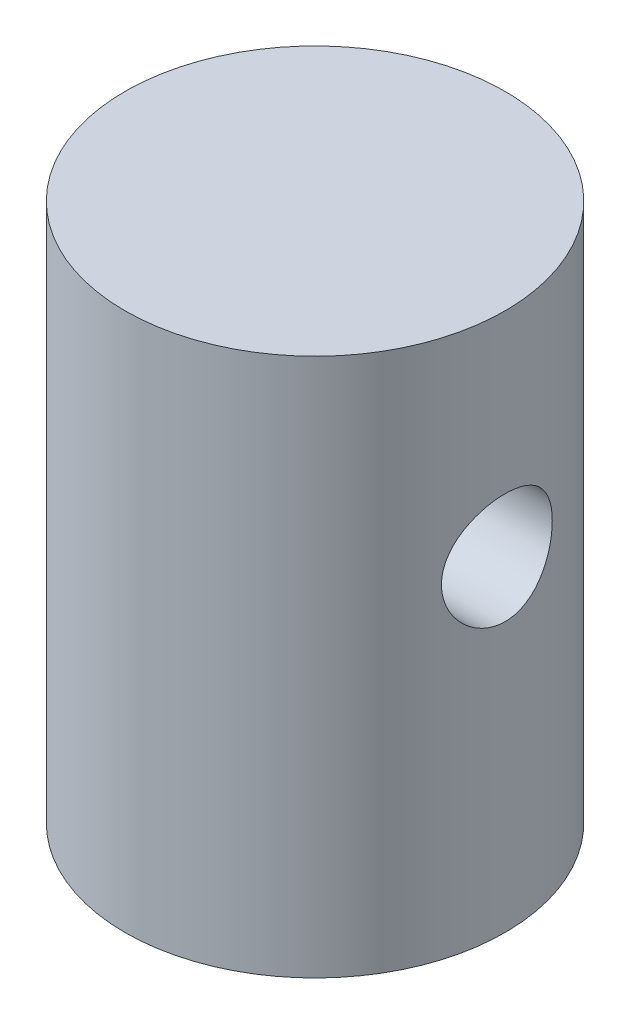
ISO-10303-21;
HEADER;
FILE_DESCRIPTION(('STEP AP214'),'2;1');
FILE_NAME('part.step','',(''),(''),'','','');
FILE_SCHEMA(('AUTOMOTIVE_DESIGN { 1 0 10303 214 1 1 1 1 }'));
ENDSEC;
DATA;
#1=APPLICATION_CONTEXT('core data for automotive mechanical design processes');
#2=APPLICATION_PROTOCOL_DEFINITION('international standard','automotive_design',2000,#1);
#3=PRODUCT_CONTEXT('',#1,'mechanical');
#4=PRODUCT('Part','Part','',(#3));
#5=PRODUCT_RELATED_PRODUCT_CATEGORY('part','',(#4));
#6=PRODUCT_DEFINITION_FORMATION('','',#4);
#7=PRODUCT_DEFINITION_CONTEXT('part definition',#1,'design');
#8=PRODUCT_DEFINITION('design','',#6,#7);
#9=PRODUCT_DEFINITION_SHAPE('','',#8);
#10=(LENGTH_UNIT() NAMED_UNIT(*) SI_UNIT(.MILLI.,.METRE.));
#11=(NAMED_UNIT(*) PLANE_ANGLE_UNIT() SI_UNIT($,.RADIAN.));
#12=(NAMED_UNIT(*) SI_UNIT($,.STERADIAN.) SOLID_ANGLE_UNIT());
#13=UNCERTAINTY_MEASURE_WITH_UNIT(LENGTH_MEASURE(1.E-05),#10,'distance_accuracy_value','');
#14=(GEOMETRIC_REPRESENTATION_CONTEXT(3) GLOBAL_UNCERTAINTY_ASSIGNED_CONTEXT((#13)) GLOBAL_UNIT_ASSIGNED_CONTEXT((#10,
#11,#12)) REPRESENTATION_CONTEXT('',''));
#15=CARTESIAN_POINT('',(0.,0.,0.));
#16=DIRECTION('',(0.,0.,1.));
#17=DIRECTION('',(1.,0.,0.));
#18=AXIS2_PLACEMENT_3D('',#15,#16,#17);
#19=CARTESIAN_POINT('',(0.,17.,0.));
#20=DIRECTION('',(0.,-1.,0.));
#21=DIRECTION('',(0.,0.,-1.));
#22=AXIS2_PLACEMENT_3D('',#19,#20,#21);
#23=CYLINDRICAL_SURFACE('',#22,6.);
#24=CARTESIAN_POINT('',(0.,17.,0.));
#25=DIRECTION('',(0.,1.,0.));
#26=DIRECTION('',(0.,0.,1.));
#27=AXIS2_PLACEMENT_3D('',#24,#25,#26);
#28=CIRCLE('',#27,6.);
#29=CARTESIAN_POINT('',(0.,17.,6.));
#30=VERTEX_POINT('',#29);
#31=EDGE_CURVE('E10',#30,#30,#28,.T.);
#32=ORIENTED_EDGE('',*,*,#31,.F.);
#33=EDGE_LOOP('',(#32));
#34=FACE_BOUND('',#33,.T.);
#35=CARTESIAN_POINT('',(0.,0.,0.));
#36=DIRECTION('',(0.,1.,0.));
#37=DIRECTION('',(0.,0.,1.));
#38=AXIS2_PLACEMENT_3D('',#35,#36,#37);
#39=CIRCLE('',#38,6.);
#40=CARTESIAN_POINT('',(0.,0.,6.));
#41=VERTEX_POINT('',#40);
#42=EDGE_CURVE('E43',#41,#41,#39,.T.);
#43=ORIENTED_EDGE('',*,*,#42,.T.);
#44=EDGE_LOOP('',(#43));
#45=FACE_BOUND('',#44,.T.);
#46=CARTESIAN_POINT('',(-5.7391201416245,10.25,1.75));
#47=CARTESIAN_POINT('',(-5.73912135233218,10.3460271599555,1.74999848143229));
#48=CARTESIAN_POINT('',(-5.74155660684103,10.4420694944477,1.7420692020193));
#49=CARTESIAN_POINT('',(-5.75099819259011,10.6313551554706,1.71063758772276));
#50=CARTESIAN_POINT('',(-5.75800624523015,10.724597414099,1.687129388205));
#51=CARTESIAN_POINT('',(-5.77573366437414,10.9055159827401,1.62539891018832));
#52=CARTESIAN_POINT('',(-5.78644710700007,10.9932009141847,1.58720010699206));
#53=CARTESIAN_POINT('',(-5.8103702792937,11.1609373789557,1.49724903480251));
#54=CARTESIAN_POINT('',(-5.82358033749983,11.2409879055555,1.44549498168001));
#55=CARTESIAN_POINT('',(-5.8514513800029,11.393577640567,1.32824554329378));
#56=CARTESIAN_POINT('',(-5.8661419700001,11.4658547086116,1.26241596701889));
#57=CARTESIAN_POINT('',(-5.89506524619861,11.5985156203088,1.11960099692238));
#58=CARTESIAN_POINT('',(-5.90929787649124,11.6588980164094,1.04261424727684));
#59=CARTESIAN_POINT('',(-5.93603636207228,11.7671820476452,0.877817715970358));
#60=CARTESIAN_POINT('',(-5.94850325436041,11.8148181347755,0.789826574692592));
#61=CARTESIAN_POINT('',(-5.96996273194609,11.8945169148794,0.606657775834811));
#62=CARTESIAN_POINT('',(-5.97895602343648,11.9265827736655,0.51148158370449));
#63=CARTESIAN_POINT('',(-5.99224555879575,11.9733683401486,0.319385326415658));
#64=CARTESIAN_POINT('',(-5.9966626309077,11.9885351093205,0.222582653190643));
#65=CARTESIAN_POINT('',(-6.0007267618746,12.0025037390232,0.0277126943123483));
#66=CARTESIAN_POINT('',(-6.00037476953799,12.001308854715,-0.0703543359177009));
#67=CARTESIAN_POINT('',(-5.99502665675503,11.9828920248792,-0.261839339010207));
#68=CARTESIAN_POINT('',(-5.99017073825665,11.9661539035478,-0.355308373260201));
#69=CARTESIAN_POINT('',(-5.97652948220135,11.917913791539,-0.538048126317028));
#70=CARTESIAN_POINT('',(-5.96774390133059,11.8864108866612,-0.627318584781338));
#71=CARTESIAN_POINT('',(-5.94703299959619,11.8091968253065,-0.800299191226942));
#72=CARTESIAN_POINT('',(-5.93507351157704,11.7633300103597,-0.883935598008257));
#73=CARTESIAN_POINT('',(-5.9092886595426,11.6588122238901,-1.04248200075495));
#74=CARTESIAN_POINT('',(-5.89546287280477,11.6001583542026,-1.11739001252847));
#75=CARTESIAN_POINT('',(-5.86683410672761,11.4692063342725,-1.25924141940852));
#76=CARTESIAN_POINT('',(-5.85201387983932,11.396488142473,-1.32579407024834));
#77=CARTESIAN_POINT('',(-5.82351168097608,11.2407757903385,-1.44586660191142));
#78=CARTESIAN_POINT('',(-5.8098298096845,11.1577807226634,-1.49938533073701));
#79=CARTESIAN_POINT('',(-5.78507419356832,10.9828896140135,-1.59224878530753));
#80=CARTESIAN_POINT('',(-5.77402396450966,10.8909229686561,-1.63146726373796));
#81=CARTESIAN_POINT('',(-5.75606450322795,10.7012949818525,-1.69374851164605));
#82=CARTESIAN_POINT('',(-5.74915400670723,10.6036353890733,-1.71681621402541));
#83=CARTESIAN_POINT('',(-5.74053185916609,10.4090960828292,-1.7454256721976));
#84=CARTESIAN_POINT('',(-5.73864494944326,10.3123109878842,-1.75155853244336));
#85=CARTESIAN_POINT('',(-5.73980029830615,10.1190937757942,-1.74776921645584));
#86=CARTESIAN_POINT('',(-5.74284191154792,10.022661614093,-1.73784914220432));
#87=CARTESIAN_POINT('',(-5.75334026618617,9.83530316808429,-1.70276068513146));
#88=CARTESIAN_POINT('',(-5.76068862380037,9.74430016112714,-1.67796628113717));
#89=CARTESIAN_POINT('',(-5.77886185683533,9.56774980326422,-1.61426316316258));
#90=CARTESIAN_POINT('',(-5.7896872485818,9.48220326488505,-1.57535235284098));
#91=CARTESIAN_POINT('',(-5.81393978491672,9.31657214599056,-1.48337952129907));
#92=CARTESIAN_POINT('',(-5.82742647058964,9.23668360317094,-1.42998054711139));
#93=CARTESIAN_POINT('',(-5.85535101590732,9.08678479747277,-1.31095181227824));
#94=CARTESIAN_POINT('',(-5.86978909009026,9.01677677391141,-1.24531928682211));
#95=CARTESIAN_POINT('',(-5.89860806740746,8.88607534857196,-1.10091901276198));
#96=CARTESIAN_POINT('',(-5.91296886248222,8.82579929648958,-1.02176859620354));
#97=CARTESIAN_POINT('',(-5.93949812101069,8.71937861199076,-0.854138226573399));
#98=CARTESIAN_POINT('',(-5.95166669713258,8.67323325324783,-0.765658753335443));
#99=CARTESIAN_POINT('',(-5.97236405546361,8.59682721514996,-0.582484879123576));
#100=CARTESIAN_POINT('',(-5.98092021102961,8.56644665900443,-0.487843729255375));
#101=CARTESIAN_POINT('',(-5.99354961087299,8.52211266137465,-0.29450689079034));
#102=CARTESIAN_POINT('',(-5.99762406124125,8.50815480023807,-0.195812300452468));
#103=CARTESIAN_POINT('',(-6.00076178273783,8.49738342425057,-0.00103743961966619));
#104=CARTESIAN_POINT('',(-6.00000245868248,8.49996299282584,0.095006840731166));
#105=CARTESIAN_POINT('',(-5.99397167828825,8.52075323057029,0.285235716014246));
#106=CARTESIAN_POINT('',(-5.98870045407916,8.53896309558674,0.379420406364285));
#107=CARTESIAN_POINT('',(-5.97428492757917,8.59012910237963,0.562376479895314));
#108=CARTESIAN_POINT('',(-5.96517853614574,8.62294107673056,0.651191371275257));
#109=CARTESIAN_POINT('',(-5.94403648997228,8.70225144324137,0.822103394195299));
#110=CARTESIAN_POINT('',(-5.93200036970177,8.74875201074879,0.904199455348199));
#111=CARTESIAN_POINT('',(-5.90580993303637,8.85577654816586,1.06207963183778));
#112=CARTESIAN_POINT('',(-5.89160195176128,8.91668704973978,1.13759275881333));
#113=CARTESIAN_POINT('',(-5.86285183048808,9.05009686891047,1.27752965774599));
#114=CARTESIAN_POINT('',(-5.84830959756853,9.12259944328176,1.34195030269254));
#115=CARTESIAN_POINT('',(-5.82006568044674,9.27954795589333,1.45966022673122));
#116=CARTESIAN_POINT('',(-5.80639844866528,9.36426914830967,1.51259163845184));
#117=CARTESIAN_POINT('',(-5.78198514023874,9.54179415346375,1.60339388987167));
#118=CARTESIAN_POINT('',(-5.77123752324486,9.63459366992905,1.64127267603193));
#119=CARTESIAN_POINT('',(-5.75505738666475,9.81392715012795,1.69707126506049));
#120=CARTESIAN_POINT('',(-5.74913519026072,9.89983693794846,1.71686706269423));
#121=CARTESIAN_POINT('',(-5.74116635043196,10.0738271479187,1.74333098170632));
#122=CARTESIAN_POINT('',(-5.73911903095286,10.1619071887048,1.7500013930944));
#123=CARTESIAN_POINT('',(-5.7391201416245,10.25,1.75));
#124=B_SPLINE_CURVE_WITH_KNOTS('',3,(#46,#47,#48,#49,#50,#51,#52,#53,#54,#55,#56,#57,#58,#59,
#60,#61,#62,#63,#64,#65,#66,#67,#68,#69,#70,#71,#72,#73,#74,#75,#76,#77,#78,#79,#80,#81,#82,#83,
#84,#85,#86,#87,#88,#89,#90,#91,#92,#93,#94,#95,#96,#97,#98,#99,#100,#101,#102,#103,#104,#105,
#106,#107,#108,#109,#110,#111,#112,#113,#114,#115,#116,#117,#118,#119,#120,#121,#122,#123),
.UNSPECIFIED.,.T.,.F.,(4,2,2,2,2,2,2,2,2,2,2,2,2,2,2,2,2,2,2,2,2,2,2,2,2,2,2,2,2,2,2,2,2,2,2,2,
2,2,4),(0.,0.287756797222523,0.575621981143361,0.863029060661795,1.15047398745513,
1.44570366788229,1.74096925486193,2.04197684943756,2.3429232160698,2.63570371118683,
2.92842595829134,3.21233131865284,3.49625426008391,3.78336718563481,4.07054525263202,
4.36821044004191,4.66590192692268,4.96616130350708,5.26632893237124,5.55587830513257,
5.84538976717712,6.12791051105673,6.41047322755234,6.70027379224019,6.99013993210846,
7.29026491272892,7.5903744641468,7.88816722411909,8.1858798241832,8.47273065365,
8.75956672600379,9.04363159851127,9.32774163809379,9.62056977394216,9.91348032442503,
10.2145064741217,10.5153734967276,10.7794001445159,11.0433807230145),.UNSPECIFIED.);
#125=CARTESIAN_POINT('',(-5.7391201416245,10.25,1.75));
#126=VERTEX_POINT('',#125);
#127=EDGE_CURVE('E49',#126,#126,#124,.T.);
#128=ORIENTED_EDGE('',*,*,#127,.F.);
#129=EDGE_LOOP('',(#128));
#130=FACE_BOUND('',#129,.T.);
#131=CARTESIAN_POINT('',(5.7391201416245,10.25,1.75));
#132=CARTESIAN_POINT('',(5.73912135233218,10.1539728400445,1.74999848143229));
#133=CARTESIAN_POINT('',(5.74155660684103,10.0579305055523,1.7420692020193));
#134=CARTESIAN_POINT('',(5.75099819259011,9.86864484452936,1.71063758772276));
#135=CARTESIAN_POINT('',(5.75800624523015,9.77540258590105,1.687129388205));
#136=CARTESIAN_POINT('',(5.77573366437414,9.5944840172599,1.62539891018832));
#137=CARTESIAN_POINT('',(5.78644710700007,9.50679908581531,1.58720010699206));
#138=CARTESIAN_POINT('',(5.8103702792937,9.33906262104433,1.49724903480251));
#139=CARTESIAN_POINT('',(5.82358033749983,9.25901209444448,1.44549498168001));
#140=CARTESIAN_POINT('',(5.8514513800029,9.10642235943304,1.32824554329378));
#141=CARTESIAN_POINT('',(5.8661419700001,9.03414529138838,1.26241596701889));
#142=CARTESIAN_POINT('',(5.89506524619861,8.90148437969117,1.11960099692238));
#143=CARTESIAN_POINT('',(5.90929787649124,8.84110198359065,1.04261424727684));
#144=CARTESIAN_POINT('',(5.93603636207228,8.73281795235476,0.877817715970358));
#145=CARTESIAN_POINT('',(5.94850325436041,8.68518186522453,0.789826574692593));
#146=CARTESIAN_POINT('',(5.96996273194609,8.60548308512065,0.606657775834812));
#147=CARTESIAN_POINT('',(5.97895602343648,8.57341722633446,0.51148158370449));
#148=CARTESIAN_POINT('',(5.99224555879575,8.52663165985142,0.319385326415658));
#149=CARTESIAN_POINT('',(5.9966626309077,8.51146489067951,0.222582653190643));
#150=CARTESIAN_POINT('',(6.0007267618746,8.49749626097677,0.0277126943123485));
#151=CARTESIAN_POINT('',(6.00037476953799,8.49869114528495,-0.0703543359177007));
#152=CARTESIAN_POINT('',(5.99502665675503,8.5171079751208,-0.261839339010207));
#153=CARTESIAN_POINT('',(5.99017073825665,8.53384609645219,-0.355308373260201));
#154=CARTESIAN_POINT('',(5.97652948220135,8.58208620846097,-0.538048126317028));
#155=CARTESIAN_POINT('',(5.96774390133059,8.61358911333876,-0.627318584781338));
#156=CARTESIAN_POINT('',(5.94703299959619,8.69080317469349,-0.800299191226942));
#157=CARTESIAN_POINT('',(5.93507351157704,8.73666998964029,-0.883935598008257));
#158=CARTESIAN_POINT('',(5.9092886595426,8.8411877761099,-1.04248200075495));
#159=CARTESIAN_POINT('',(5.89546287280477,8.89984164579744,-1.11739001252847));
#160=CARTESIAN_POINT('',(5.86683410672761,9.03079366572751,-1.25924141940852));
#161=CARTESIAN_POINT('',(5.85201387983932,9.10351185752698,-1.32579407024834));
#162=CARTESIAN_POINT('',(5.82351168097608,9.25922420966148,-1.44586660191142));
#163=CARTESIAN_POINT('',(5.8098298096845,9.34221927733664,-1.49938533073701));
#164=CARTESIAN_POINT('',(5.78507419356832,9.51711038598652,-1.59224878530753));
#165=CARTESIAN_POINT('',(5.77402396450966,9.60907703134393,-1.63146726373796));
#166=CARTESIAN_POINT('',(5.75606450322795,9.79870501814748,-1.69374851164605));
#167=CARTESIAN_POINT('',(5.74915400670723,9.89636461092672,-1.71681621402541));
#168=CARTESIAN_POINT('',(5.74053185916609,10.0909039171708,-1.7454256721976));
#169=CARTESIAN_POINT('',(5.73864494944326,10.1876890121158,-1.75155853244336));
#170=CARTESIAN_POINT('',(5.73980029830615,10.3809062242058,-1.74776921645584));
#171=CARTESIAN_POINT('',(5.74284191154792,10.477338385907,-1.73784914220432));
#172=CARTESIAN_POINT('',(5.75334026618617,10.6646968319157,-1.70276068513146));
#173=CARTESIAN_POINT('',(5.76068862380037,10.7556998388729,-1.67796628113717));
#174=CARTESIAN_POINT('',(5.77886185683533,10.9322501967358,-1.61426316316258));
#175=CARTESIAN_POINT('',(5.7896872485818,11.017796735115,-1.57535235284098));
#176=CARTESIAN_POINT('',(5.81393978491672,11.1834278540094,-1.48337952129907));
#177=CARTESIAN_POINT('',(5.82742647058964,11.2633163968291,-1.42998054711139));
#178=CARTESIAN_POINT('',(5.85535101590732,11.4132152025272,-1.31095181227824));
#179=CARTESIAN_POINT('',(5.86978909009026,11.4832232260886,-1.24531928682211));
#180=CARTESIAN_POINT('',(5.89860806740746,11.613924651428,-1.10091901276198));
#181=CARTESIAN_POINT('',(5.91296886248222,11.6742007035104,-1.02176859620354));
#182=CARTESIAN_POINT('',(5.93949812101069,11.7806213880092,-0.854138226573399));
#183=CARTESIAN_POINT('',(5.95166669713258,11.8267667467522,-0.765658753335443));
#184=CARTESIAN_POINT('',(5.97236405546361,11.90317278485,-0.582484879123576));
#185=CARTESIAN_POINT('',(5.98092021102961,11.9335533409956,-0.487843729255375));
#186=CARTESIAN_POINT('',(5.99354961087299,11.9778873386253,-0.29450689079034));
#187=CARTESIAN_POINT('',(5.99762406124125,11.9918451997619,-0.195812300452468));
#188=CARTESIAN_POINT('',(6.00076178273783,12.0026165757494,-0.00103743961966619));
#189=CARTESIAN_POINT('',(6.00000245868248,12.0000370071742,0.095006840731166));
#190=CARTESIAN_POINT('',(5.99397167828825,11.9792467694297,0.285235716014246));
#191=CARTESIAN_POINT('',(5.98870045407916,11.9610369044133,0.379420406364285));
#192=CARTESIAN_POINT('',(5.97428492757917,11.9098708976204,0.562376479895314));
#193=CARTESIAN_POINT('',(5.96517853614574,11.8770589232695,0.651191371275256));
#194=CARTESIAN_POINT('',(5.94403648997228,11.7977485567586,0.822103394195298));
#195=CARTESIAN_POINT('',(5.93200036970177,11.7512479892512,0.904199455348199));
#196=CARTESIAN_POINT('',(5.90580993303637,11.6442234518341,1.06207963183778));
#197=CARTESIAN_POINT('',(5.89160195176128,11.5833129502602,1.13759275881333));
#198=CARTESIAN_POINT('',(5.86285183048808,11.4499031310895,1.27752965774599));
#199=CARTESIAN_POINT('',(5.84830959756853,11.3774005567182,1.34195030269254));
#200=CARTESIAN_POINT('',(5.82006568044674,11.2204520441067,1.45966022673122));
#201=CARTESIAN_POINT('',(5.80639844866528,11.1357308516903,1.51259163845184));
#202=CARTESIAN_POINT('',(5.78198514023874,10.9582058465363,1.60339388987167));
#203=CARTESIAN_POINT('',(5.77123752324486,10.865406330071,1.64127267603193));
#204=CARTESIAN_POINT('',(5.75505738666475,10.6860728498721,1.69707126506049));
#205=CARTESIAN_POINT('',(5.74913519026072,10.6001630620515,1.71686706269423));
#206=CARTESIAN_POINT('',(5.74116635043196,10.4261728520813,1.74333098170632));
#207=CARTESIAN_POINT('',(5.73911903095286,10.3380928112952,1.7500013930944));
#208=CARTESIAN_POINT('',(5.7391201416245,10.25,1.75));
#209=B_SPLINE_CURVE_WITH_KNOTS('',3,(#131,#132,#133,#134,#135,#136,#137,#138,#139,#140,#141,
#142,#143,#144,#145,#146,#147,#148,#149,#150,#151,#152,#153,#154,#155,#156,#157,#158,#159,#160,
#161,#162,#163,#164,#165,#166,#167,#168,#169,#170,#171,#172,#173,#174,#175,#176,#177,#178,#179,
#180,#181,#182,#183,#184,#185,#186,#187,#188,#189,#190,#191,#192,#193,#194,#195,#196,#197,#198,
#199,#200,#201,#202,#203,#204,#205,#206,#207,#208),.UNSPECIFIED.,.T.,.F.,(4,2,2,2,2,2,2,2,2,2,2,
2,2,2,2,2,2,2,2,2,2,2,2,2,2,2,2,2,2,2,2,2,2,2,2,2,2,2,4),(0.,0.287756797222523,
0.575621981143361,0.863029060661795,1.15047398745513,1.44570366788229,1.74096925486193,
2.04197684943756,2.3429232160698,2.63570371118683,2.92842595829134,3.21233131865284,
3.49625426008391,3.78336718563481,4.07054525263202,4.36821044004191,4.66590192692268,
4.96616130350708,5.26632893237124,5.55587830513257,5.84538976717712,6.12791051105673,
6.41047322755234,6.70027379224019,6.99013993210846,7.29026491272892,7.5903744641468,
7.88816722411909,8.1858798241832,8.47273065365,8.75956672600379,9.04363159851127,
9.32774163809379,9.62056977394216,9.91348032442503,10.2145064741217,10.5153734967276,
10.7794001445159,11.0433807230145),.UNSPECIFIED.);
#210=CARTESIAN_POINT('',(5.7391201416245,10.25,1.75));
#211=VERTEX_POINT('',#210);
#212=EDGE_CURVE('E35',#211,#211,#209,.T.);
#213=ORIENTED_EDGE('',*,*,#212,.F.);
#214=EDGE_LOOP('',(#213));
#215=FACE_BOUND('',#214,.T.);
#216=ADVANCED_FACE('F31',(#34,#45,#130,#215),#23,.T.);
#217=CARTESIAN_POINT('',(0.,17.,0.));
#218=DIRECTION('',(0.,1.,0.));
#219=DIRECTION('',(0.,0.,1.));
#220=AXIS2_PLACEMENT_3D('',#217,#218,#219);
#221=PLANE('',#220);
#222=ORIENTED_EDGE('',*,*,#31,.T.);
#223=EDGE_LOOP('',(#222));
#224=FACE_BOUND('',#223,.T.);
#225=ADVANCED_FACE('F60',(#224),#221,.T.);
#226=CARTESIAN_POINT('',(0.,0.,0.));
#227=DIRECTION('',(0.,1.,0.));
#228=DIRECTION('',(0.,0.,1.));
#229=AXIS2_PLACEMENT_3D('',#226,#227,#228);
#230=PLANE('',#229);
#231=ORIENTED_EDGE('',*,*,#42,.F.);
#232=EDGE_LOOP('',(#231));
#233=FACE_BOUND('',#232,.T.);
#234=ADVANCED_FACE('F58',(#233),#230,.F.);
#235=CARTESIAN_POINT('',(17.,10.25,0.));
#236=DIRECTION('',(-1.,0.,0.));
#237=DIRECTION('',(0.,0.,1.));
#238=AXIS2_PLACEMENT_3D('',#235,#236,#237);
#239=CYLINDRICAL_SURFACE('',#238,1.75);
#240=ORIENTED_EDGE('',*,*,#127,.T.);
#241=EDGE_LOOP('',(#240));
#242=FACE_BOUND('',#241,.T.);
#243=ORIENTED_EDGE('',*,*,#212,.T.);
#244=EDGE_LOOP('',(#243));
#245=FACE_BOUND('',#244,.T.);
#246=ADVANCED_FACE('F54',(#242,#245),#239,.F.);
#247=CLOSED_SHELL('',(#216,#225,#234,#246));
#248=MANIFOLD_SOLID_BREP('B2',#247);
#249=ADVANCED_BREP_SHAPE_REPRESENTATION('',(#18,#248),#14);
#250=SHAPE_DEFINITION_REPRESENTATION(#9,#249);
ENDSEC;
END-ISO-10303-21;
